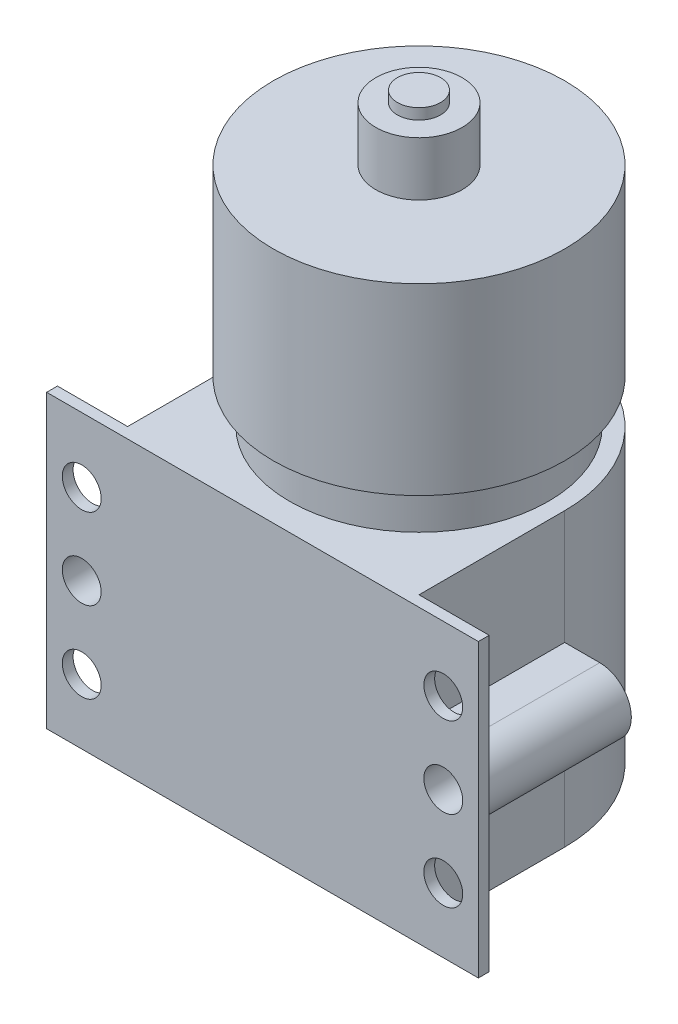
ISO-10303-21;
HEADER;
FILE_DESCRIPTION(('STEP AP214'),'2;1');
FILE_NAME('part.step','',(''),(''),'','','');
FILE_SCHEMA(('AUTOMOTIVE_DESIGN { 1 0 10303 214 1 1 1 1 }'));
ENDSEC;
DATA;
#1=APPLICATION_CONTEXT('core data for automotive mechanical design processes');
#2=APPLICATION_PROTOCOL_DEFINITION('international standard','automotive_design',2000,#1);
#3=PRODUCT_CONTEXT('',#1,'mechanical');
#4=PRODUCT('Part','Part','',(#3));
#5=PRODUCT_RELATED_PRODUCT_CATEGORY('part','',(#4));
#6=PRODUCT_DEFINITION_FORMATION('','',#4);
#7=PRODUCT_DEFINITION_CONTEXT('part definition',#1,'design');
#8=PRODUCT_DEFINITION('design','',#6,#7);
#9=PRODUCT_DEFINITION_SHAPE('','',#8);
#10=(LENGTH_UNIT() NAMED_UNIT(*) SI_UNIT(.MILLI.,.METRE.));
#11=(NAMED_UNIT(*) PLANE_ANGLE_UNIT() SI_UNIT($,.RADIAN.));
#12=(NAMED_UNIT(*) SI_UNIT($,.STERADIAN.) SOLID_ANGLE_UNIT());
#13=UNCERTAINTY_MEASURE_WITH_UNIT(LENGTH_MEASURE(1.E-05),#10,'distance_accuracy_value','');
#14=(GEOMETRIC_REPRESENTATION_CONTEXT(3) GLOBAL_UNCERTAINTY_ASSIGNED_CONTEXT((#13)) GLOBAL_UNIT_ASSIGNED_CONTEXT((#10,
#11,#12)) REPRESENTATION_CONTEXT('',''));
#15=CARTESIAN_POINT('',(0.,0.,0.));
#16=DIRECTION('',(0.,0.,1.));
#17=DIRECTION('',(1.,0.,0.));
#18=AXIS2_PLACEMENT_3D('',#15,#16,#17);
#19=CARTESIAN_POINT('',(13.5,27.,0.));
#20=DIRECTION('',(1.,0.,0.));
#21=DIRECTION('',(0.,0.,-1.));
#22=AXIS2_PLACEMENT_3D('',#19,#20,#21);
#23=PLANE('',#22);
#24=DIRECTION('',(0.,-1.,0.));
#25=VECTOR('',#24,1.);
#26=CARTESIAN_POINT('',(13.5,27.,0.));
#27=LINE('',#26,#25);
#28=CARTESIAN_POINT('',(13.5,10.575,0.));
#29=VERTEX_POINT('',#28);
#30=CARTESIAN_POINT('',(13.5,0.,0.));
#31=VERTEX_POINT('',#30);
#32=EDGE_CURVE('E258',#29,#31,#27,.T.);
#33=ORIENTED_EDGE('',*,*,#32,.F.);
#34=DIRECTION('',(0.,0.,1.));
#35=VECTOR('',#34,1.);
#36=CARTESIAN_POINT('',(13.5,10.575,0.));
#37=LINE('',#36,#35);
#38=CARTESIAN_POINT('',(13.5,10.575,13.5));
#39=VERTEX_POINT('',#38);
#40=EDGE_CURVE('E49',#29,#39,#37,.T.);
#41=ORIENTED_EDGE('',*,*,#40,.T.);
#42=DIRECTION('',(0.,-1.,0.));
#43=VECTOR('',#42,1.);
#44=CARTESIAN_POINT('',(13.5,27.,13.5));
#45=LINE('',#44,#43);
#46=CARTESIAN_POINT('',(13.5,0.,13.5));
#47=VERTEX_POINT('',#46);
#48=EDGE_CURVE('E262',#39,#47,#45,.T.);
#49=ORIENTED_EDGE('',*,*,#48,.T.);
#50=DIRECTION('',(0.,0.,1.));
#51=VECTOR('',#50,1.);
#52=CARTESIAN_POINT('',(13.5,0.,0.));
#53=LINE('',#52,#51);
#54=EDGE_CURVE('E250',#31,#47,#53,.T.);
#55=ORIENTED_EDGE('',*,*,#54,.F.);
#56=EDGE_LOOP('',(#33,#41,#49,#55));
#57=FACE_BOUND('',#56,.T.);
#58=ADVANCED_FACE('F34',(#57),#23,.T.);
#59=CARTESIAN_POINT('',(-13.5,27.,0.));
#60=DIRECTION('',(1.,0.,0.));
#61=DIRECTION('',(0.,0.,-1.));
#62=AXIS2_PLACEMENT_3D('',#59,#60,#61);
#63=PLANE('',#62);
#64=DIRECTION('',(0.,0.,1.));
#65=VECTOR('',#64,1.);
#66=CARTESIAN_POINT('',(-13.5,16.425,0.));
#67=LINE('',#66,#65);
#68=CARTESIAN_POINT('',(-13.5,16.425,0.));
#69=VERTEX_POINT('',#68);
#70=CARTESIAN_POINT('',(-13.5,16.425,13.5));
#71=VERTEX_POINT('',#70);
#72=EDGE_CURVE('E211',#69,#71,#67,.T.);
#73=ORIENTED_EDGE('',*,*,#72,.T.);
#74=DIRECTION('',(0.,-1.,0.));
#75=VECTOR('',#74,1.);
#76=CARTESIAN_POINT('',(-13.5,27.,13.5));
#77=LINE('',#76,#75);
#78=CARTESIAN_POINT('',(-13.5,27.,13.5));
#79=VERTEX_POINT('',#78);
#80=EDGE_CURVE('E42',#79,#71,#77,.T.);
#81=ORIENTED_EDGE('',*,*,#80,.F.);
#82=DIRECTION('',(0.,0.,1.));
#83=VECTOR('',#82,1.);
#84=CARTESIAN_POINT('',(-13.5,27.,0.));
#85=LINE('',#84,#83);
#86=CARTESIAN_POINT('',(-13.5,27.,0.));
#87=VERTEX_POINT('',#86);
#88=EDGE_CURVE('E216',#87,#79,#85,.T.);
#89=ORIENTED_EDGE('',*,*,#88,.F.);
#90=DIRECTION('',(0.,-1.,0.));
#91=VECTOR('',#90,1.);
#92=CARTESIAN_POINT('',(-13.5,27.,0.));
#93=LINE('',#92,#91);
#94=EDGE_CURVE('E255',#87,#69,#93,.T.);
#95=ORIENTED_EDGE('',*,*,#94,.T.);
#96=EDGE_LOOP('',(#73,#81,#89,#95));
#97=FACE_BOUND('',#96,.T.);
#98=ADVANCED_FACE('F307',(#97),#63,.F.);
#99=CARTESIAN_POINT('',(0.,27.,13.5));
#100=DIRECTION('',(0.,0.,-1.));
#101=DIRECTION('',(-1.,0.,0.));
#102=AXIS2_PLACEMENT_3D('',#99,#100,#101);
#103=PLANE('',#102);
#104=CARTESIAN_POINT('',(-16.75,21.,13.5));
#105=DIRECTION('',(0.,0.,-1.));
#106=DIRECTION('',(-1.,0.,0.));
#107=AXIS2_PLACEMENT_3D('',#104,#105,#106);
#108=CIRCLE('',#107,1.79999999999999);
#109=CARTESIAN_POINT('',(-18.55,21.,13.5));
#110=VERTEX_POINT('',#109);
#111=EDGE_CURVE('E617',#110,#110,#108,.T.);
#112=ORIENTED_EDGE('',*,*,#111,.F.);
#113=EDGE_LOOP('',(#112));
#114=FACE_BOUND('',#113,.T.);
#115=CARTESIAN_POINT('',(-16.75,6.,13.5));
#116=DIRECTION('',(0.,0.,-1.));
#117=DIRECTION('',(-1.,0.,0.));
#118=AXIS2_PLACEMENT_3D('',#115,#116,#117);
#119=CIRCLE('',#118,1.79999999999999);
#120=CARTESIAN_POINT('',(-18.55,6.,13.5));
#121=VERTEX_POINT('',#120);
#122=EDGE_CURVE('E620',#121,#121,#119,.T.);
#123=ORIENTED_EDGE('',*,*,#122,.F.);
#124=EDGE_LOOP('',(#123));
#125=FACE_BOUND('',#124,.T.);
#126=ORIENTED_EDGE('',*,*,#80,.T.);
#127=DIRECTION('',(1.,0.,0.));
#128=VECTOR('',#127,1.);
#129=CARTESIAN_POINT('',(0.,16.425,13.5));
#130=LINE('',#129,#128);
#131=CARTESIAN_POINT('',(-16.75,16.425,13.5));
#132=VERTEX_POINT('',#131);
#133=EDGE_CURVE('E57',#132,#71,#130,.T.);
#134=ORIENTED_EDGE('',*,*,#133,.F.);
#135=CARTESIAN_POINT('',(-16.75,13.5,13.5));
#136=DIRECTION('',(0.,0.,-1.));
#137=DIRECTION('',(-1.,0.,0.));
#138=AXIS2_PLACEMENT_3D('',#135,#136,#137);
#139=CIRCLE('',#138,2.92500000000001);
#140=CARTESIAN_POINT('',(-16.75,10.575,13.5));
#141=VERTEX_POINT('',#140);
#142=EDGE_CURVE('E159',#141,#132,#139,.T.);
#143=ORIENTED_EDGE('',*,*,#142,.F.);
#144=DIRECTION('',(1.,0.,0.));
#145=VECTOR('',#144,1.);
#146=CARTESIAN_POINT('',(0.,10.575,13.5));
#147=LINE('',#146,#145);
#148=CARTESIAN_POINT('',(-13.5,10.575,13.5));
#149=VERTEX_POINT('',#148);
#150=EDGE_CURVE('E192',#141,#149,#147,.T.);
#151=ORIENTED_EDGE('',*,*,#150,.T.);
#152=CARTESIAN_POINT('',(-13.5,0.,13.5));
#153=VERTEX_POINT('',#152);
#154=EDGE_CURVE('E274',#149,#153,#77,.T.);
#155=ORIENTED_EDGE('',*,*,#154,.T.);
#156=DIRECTION('',(1.,0.,0.));
#157=VECTOR('',#156,1.);
#158=CARTESIAN_POINT('',(0.,0.,13.5));
#159=LINE('',#158,#157);
#160=CARTESIAN_POINT('',(-20.,0.,13.5));
#161=VERTEX_POINT('',#160);
#162=EDGE_CURVE('E238',#161,#153,#159,.T.);
#163=ORIENTED_EDGE('',*,*,#162,.F.);
#164=DIRECTION('',(0.,-1.,0.));
#165=VECTOR('',#164,1.);
#166=CARTESIAN_POINT('',(-20.,27.,13.5));
#167=LINE('',#166,#165);
#168=CARTESIAN_POINT('',(-20.,27.,13.5));
#169=VERTEX_POINT('',#168);
#170=EDGE_CURVE('E273',#169,#161,#167,.T.);
#171=ORIENTED_EDGE('',*,*,#170,.F.);
#172=DIRECTION('',(1.,0.,0.));
#173=VECTOR('',#172,1.);
#174=CARTESIAN_POINT('',(0.,27.,13.5));
#175=LINE('',#174,#173);
#176=EDGE_CURVE('E218',#169,#79,#175,.T.);
#177=ORIENTED_EDGE('',*,*,#176,.T.);
#178=EDGE_LOOP('',(#126,#134,#143,#151,#155,#163,#171,#177));
#179=FACE_BOUND('',#178,.T.);
#180=ADVANCED_FACE('F278',(#114,#125,#179),#103,.T.);
#181=ORIENTED_EDGE('',*,*,#154,.F.);
#182=DIRECTION('',(0.,0.,1.));
#183=VECTOR('',#182,1.);
#184=CARTESIAN_POINT('',(-13.5,10.575,0.));
#185=LINE('',#184,#183);
#186=CARTESIAN_POINT('',(-13.5,10.575,0.));
#187=VERTEX_POINT('',#186);
#188=EDGE_CURVE('E208',#187,#149,#185,.T.);
#189=ORIENTED_EDGE('',*,*,#188,.F.);
#190=CARTESIAN_POINT('',(-13.5,0.,0.));
#191=VERTEX_POINT('',#190);
#192=EDGE_CURVE('E235',#187,#191,#93,.T.);
#193=ORIENTED_EDGE('',*,*,#192,.T.);
#194=DIRECTION('',(0.,0.,1.));
#195=VECTOR('',#194,1.);
#196=CARTESIAN_POINT('',(-13.5,0.,0.));
#197=LINE('',#196,#195);
#198=EDGE_CURVE('E215',#191,#153,#197,.T.);
#199=ORIENTED_EDGE('',*,*,#198,.T.);
#200=EDGE_LOOP('',(#181,#189,#193,#199));
#201=FACE_BOUND('',#200,.T.);
#202=ADVANCED_FACE('F36',(#201),#63,.F.);
#203=CARTESIAN_POINT('',(-20.,27.,0.));
#204=DIRECTION('',(1.,0.,0.));
#205=DIRECTION('',(0.,0.,-1.));
#206=AXIS2_PLACEMENT_3D('',#203,#204,#205);
#207=PLANE('',#206);
#208=DIRECTION('',(0.,0.,1.));
#209=VECTOR('',#208,1.);
#210=CARTESIAN_POINT('',(-20.,0.,0.));
#211=LINE('',#210,#209);
#212=CARTESIAN_POINT('',(-20.,0.,14.5));
#213=VERTEX_POINT('',#212);
#214=EDGE_CURVE('E241',#161,#213,#211,.T.);
#215=ORIENTED_EDGE('',*,*,#214,.T.);
#216=DIRECTION('',(0.,-1.,0.));
#217=VECTOR('',#216,1.);
#218=CARTESIAN_POINT('',(-20.,27.,14.5));
#219=LINE('',#218,#217);
#220=CARTESIAN_POINT('',(-20.,27.,14.5));
#221=VERTEX_POINT('',#220);
#222=EDGE_CURVE('E270',#221,#213,#219,.T.);
#223=ORIENTED_EDGE('',*,*,#222,.F.);
#224=DIRECTION('',(0.,0.,1.));
#225=VECTOR('',#224,1.);
#226=CARTESIAN_POINT('',(-20.,27.,0.));
#227=LINE('',#226,#225);
#228=EDGE_CURVE('E222',#169,#221,#227,.T.);
#229=ORIENTED_EDGE('',*,*,#228,.F.);
#230=ORIENTED_EDGE('',*,*,#170,.T.);
#231=EDGE_LOOP('',(#215,#223,#229,#230));
#232=FACE_BOUND('',#231,.T.);
#233=ADVANCED_FACE('F290',(#232),#207,.F.);
#234=CARTESIAN_POINT('',(0.,27.,14.5));
#235=DIRECTION('',(0.,0.,-1.));
#236=DIRECTION('',(-1.,0.,0.));
#237=AXIS2_PLACEMENT_3D('',#234,#235,#236);
#238=PLANE('',#237);
#239=CARTESIAN_POINT('',(16.75,21.,14.5));
#240=DIRECTION('',(0.,0.,-1.));
#241=DIRECTION('',(-1.,0.,0.));
#242=AXIS2_PLACEMENT_3D('',#239,#240,#241);
#243=CIRCLE('',#242,1.8);
#244=CARTESIAN_POINT('',(14.95,21.,14.5));
#245=VERTEX_POINT('',#244);
#246=EDGE_CURVE('E702',#245,#245,#243,.T.);
#247=ORIENTED_EDGE('',*,*,#246,.T.);
#248=EDGE_LOOP('',(#247));
#249=FACE_BOUND('',#248,.T.);
#250=CARTESIAN_POINT('',(16.75,13.5,14.5));
#251=DIRECTION('',(0.,0.,-1.));
#252=DIRECTION('',(-1.,0.,0.));
#253=AXIS2_PLACEMENT_3D('',#250,#251,#252);
#254=CIRCLE('',#253,1.8);
#255=CARTESIAN_POINT('',(14.95,13.5,14.5));
#256=VERTEX_POINT('',#255);
#257=EDGE_CURVE('E712',#256,#256,#254,.T.);
#258=ORIENTED_EDGE('',*,*,#257,.T.);
#259=EDGE_LOOP('',(#258));
#260=FACE_BOUND('',#259,.T.);
#261=CARTESIAN_POINT('',(16.75,6.,14.5));
#262=DIRECTION('',(0.,0.,-1.));
#263=DIRECTION('',(-1.,0.,0.));
#264=AXIS2_PLACEMENT_3D('',#261,#262,#263);
#265=CIRCLE('',#264,1.8);
#266=CARTESIAN_POINT('',(14.95,6.,14.5));
#267=VERTEX_POINT('',#266);
#268=EDGE_CURVE('E718',#267,#267,#265,.T.);
#269=ORIENTED_EDGE('',*,*,#268,.T.);
#270=EDGE_LOOP('',(#269));
#271=FACE_BOUND('',#270,.T.);
#272=CARTESIAN_POINT('',(-16.75,21.,14.5));
#273=DIRECTION('',(0.,0.,-1.));
#274=DIRECTION('',(-1.,0.,0.));
#275=AXIS2_PLACEMENT_3D('',#272,#273,#274);
#276=CIRCLE('',#275,1.8);
#277=CARTESIAN_POINT('',(-18.55,21.,14.5));
#278=VERTEX_POINT('',#277);
#279=EDGE_CURVE('E623',#278,#278,#276,.T.);
#280=ORIENTED_EDGE('',*,*,#279,.T.);
#281=EDGE_LOOP('',(#280));
#282=FACE_BOUND('',#281,.T.);
#283=CARTESIAN_POINT('',(-16.75,6.,14.5));
#284=DIRECTION('',(0.,0.,-1.));
#285=DIRECTION('',(-1.,0.,0.));
#286=AXIS2_PLACEMENT_3D('',#283,#284,#285);
#287=CIRCLE('',#286,1.8);
#288=CARTESIAN_POINT('',(-18.55,6.,14.5));
#289=VERTEX_POINT('',#288);
#290=EDGE_CURVE('E622',#289,#289,#287,.T.);
#291=ORIENTED_EDGE('',*,*,#290,.T.);
#292=EDGE_LOOP('',(#291));
#293=FACE_BOUND('',#292,.T.);
#294=CARTESIAN_POINT('',(-16.75,13.5,14.5));
#295=DIRECTION('',(0.,0.,-1.));
#296=DIRECTION('',(-1.,0.,0.));
#297=AXIS2_PLACEMENT_3D('',#294,#295,#296);
#298=CIRCLE('',#297,1.8);
#299=CARTESIAN_POINT('',(-18.55,13.5,14.5));
#300=VERTEX_POINT('',#299);
#301=EDGE_CURVE('E634',#300,#300,#298,.T.);
#302=ORIENTED_EDGE('',*,*,#301,.T.);
#303=EDGE_LOOP('',(#302));
#304=FACE_BOUND('',#303,.T.);
#305=DIRECTION('',(1.,0.,0.));
#306=VECTOR('',#305,1.);
#307=CARTESIAN_POINT('',(0.,0.,14.5));
#308=LINE('',#307,#306);
#309=CARTESIAN_POINT('',(20.,0.,14.5));
#310=VERTEX_POINT('',#309);
#311=EDGE_CURVE('E244',#213,#310,#308,.T.);
#312=ORIENTED_EDGE('',*,*,#311,.T.);
#313=DIRECTION('',(0.,-1.,0.));
#314=VECTOR('',#313,1.);
#315=CARTESIAN_POINT('',(20.,27.,14.5));
#316=LINE('',#315,#314);
#317=CARTESIAN_POINT('',(20.,27.,14.5));
#318=VERTEX_POINT('',#317);
#319=EDGE_CURVE('E268',#318,#310,#316,.T.);
#320=ORIENTED_EDGE('',*,*,#319,.F.);
#321=DIRECTION('',(1.,0.,0.));
#322=VECTOR('',#321,1.);
#323=CARTESIAN_POINT('',(0.,27.,14.5));
#324=LINE('',#323,#322);
#325=EDGE_CURVE('E225',#221,#318,#324,.T.);
#326=ORIENTED_EDGE('',*,*,#325,.F.);
#327=ORIENTED_EDGE('',*,*,#222,.T.);
#328=EDGE_LOOP('',(#312,#320,#326,#327));
#329=FACE_BOUND('',#328,.T.);
#330=ADVANCED_FACE('F294',(#249,#260,#271,#282,#293,#304,#329),#238,.F.);
#331=CARTESIAN_POINT('',(20.,27.,0.));
#332=DIRECTION('',(1.,0.,0.));
#333=DIRECTION('',(0.,0.,-1.));
#334=AXIS2_PLACEMENT_3D('',#331,#332,#333);
#335=PLANE('',#334);
#336=DIRECTION('',(0.,0.,1.));
#337=VECTOR('',#336,1.);
#338=CARTESIAN_POINT('',(20.,0.,0.));
#339=LINE('',#338,#337);
#340=CARTESIAN_POINT('',(20.,0.,13.5));
#341=VERTEX_POINT('',#340);
#342=EDGE_CURVE('E247',#341,#310,#339,.T.);
#343=ORIENTED_EDGE('',*,*,#342,.F.);
#344=DIRECTION('',(0.,-1.,0.));
#345=VECTOR('',#344,1.);
#346=CARTESIAN_POINT('',(20.,27.,13.5));
#347=LINE('',#346,#345);
#348=CARTESIAN_POINT('',(20.,27.,13.5));
#349=VERTEX_POINT('',#348);
#350=EDGE_CURVE('E266',#349,#341,#347,.T.);
#351=ORIENTED_EDGE('',*,*,#350,.F.);
#352=DIRECTION('',(0.,0.,1.));
#353=VECTOR('',#352,1.);
#354=CARTESIAN_POINT('',(20.,27.,0.));
#355=LINE('',#354,#353);
#356=EDGE_CURVE('E227',#349,#318,#355,.T.);
#357=ORIENTED_EDGE('',*,*,#356,.T.);
#358=ORIENTED_EDGE('',*,*,#319,.T.);
#359=EDGE_LOOP('',(#343,#351,#357,#358));
#360=FACE_BOUND('',#359,.T.);
#361=ADVANCED_FACE('F333',(#360),#335,.T.);
#362=CARTESIAN_POINT('',(16.75,21.,13.5));
#363=DIRECTION('',(0.,0.,-1.));
#364=DIRECTION('',(-1.,0.,0.));
#365=AXIS2_PLACEMENT_3D('',#362,#363,#364);
#366=CIRCLE('',#365,1.79999999999999);
#367=CARTESIAN_POINT('',(14.95,21.,13.5));
#368=VERTEX_POINT('',#367);
#369=EDGE_CURVE('E705',#368,#368,#366,.T.);
#370=ORIENTED_EDGE('',*,*,#369,.F.);
#371=EDGE_LOOP('',(#370));
#372=FACE_BOUND('',#371,.T.);
#373=CARTESIAN_POINT('',(16.75,6.,13.5));
#374=DIRECTION('',(0.,0.,-1.));
#375=DIRECTION('',(-1.,0.,0.));
#376=AXIS2_PLACEMENT_3D('',#373,#374,#375);
#377=CIRCLE('',#376,1.79999999999999);
#378=CARTESIAN_POINT('',(14.95,6.,13.5));
#379=VERTEX_POINT('',#378);
#380=EDGE_CURVE('E715',#379,#379,#377,.T.);
#381=ORIENTED_EDGE('',*,*,#380,.F.);
#382=EDGE_LOOP('',(#381));
#383=FACE_BOUND('',#382,.T.);
#384=DIRECTION('',(-1.,0.,0.));
#385=VECTOR('',#384,1.);
#386=CARTESIAN_POINT('',(0.,16.425,13.5));
#387=LINE('',#386,#385);
#388=CARTESIAN_POINT('',(16.75,16.425,13.5));
#389=VERTEX_POINT('',#388);
#390=CARTESIAN_POINT('',(13.5,16.425,13.5));
#391=VERTEX_POINT('',#390);
#392=EDGE_CURVE('E156',#389,#391,#387,.T.);
#393=ORIENTED_EDGE('',*,*,#392,.T.);
#394=CARTESIAN_POINT('',(13.5,27.,13.5));
#395=VERTEX_POINT('',#394);
#396=EDGE_CURVE('E263',#395,#391,#45,.T.);
#397=ORIENTED_EDGE('',*,*,#396,.F.);
#398=EDGE_CURVE('E223',#395,#349,#175,.T.);
#399=ORIENTED_EDGE('',*,*,#398,.T.);
#400=ORIENTED_EDGE('',*,*,#350,.T.);
#401=EDGE_CURVE('E242',#47,#341,#159,.T.);
#402=ORIENTED_EDGE('',*,*,#401,.F.);
#403=ORIENTED_EDGE('',*,*,#48,.F.);
#404=DIRECTION('',(-1.,0.,0.));
#405=VECTOR('',#404,1.);
#406=CARTESIAN_POINT('',(0.,10.575,13.5));
#407=LINE('',#406,#405);
#408=CARTESIAN_POINT('',(16.75,10.575,13.5));
#409=VERTEX_POINT('',#408);
#410=EDGE_CURVE('E172',#409,#39,#407,.T.);
#411=ORIENTED_EDGE('',*,*,#410,.F.);
#412=CARTESIAN_POINT('',(16.75,13.5,13.5));
#413=DIRECTION('',(0.,0.,-1.));
#414=DIRECTION('',(-1.,0.,0.));
#415=AXIS2_PLACEMENT_3D('',#412,#413,#414);
#416=CIRCLE('',#415,2.925);
#417=EDGE_CURVE('E174',#389,#409,#416,.T.);
#418=ORIENTED_EDGE('',*,*,#417,.F.);
#419=EDGE_LOOP('',(#393,#397,#399,#400,#402,#403,#411,#418));
#420=FACE_BOUND('',#419,.T.);
#421=ADVANCED_FACE('F330',(#372,#383,#420),#103,.T.);
#422=DIRECTION('',(0.,0.,1.));
#423=VECTOR('',#422,1.);
#424=CARTESIAN_POINT('',(13.5,16.425,0.));
#425=LINE('',#424,#423);
#426=CARTESIAN_POINT('',(13.5,16.425,0.));
#427=VERTEX_POINT('',#426);
#428=EDGE_CURVE('E182',#427,#391,#425,.T.);
#429=ORIENTED_EDGE('',*,*,#428,.F.);
#430=CARTESIAN_POINT('',(13.5,27.,0.));
#431=VERTEX_POINT('',#430);
#432=EDGE_CURVE('E259',#431,#427,#27,.T.);
#433=ORIENTED_EDGE('',*,*,#432,.F.);
#434=DIRECTION('',(0.,0.,1.));
#435=VECTOR('',#434,1.);
#436=CARTESIAN_POINT('',(13.5,27.,0.));
#437=LINE('',#436,#435);
#438=EDGE_CURVE('E230',#431,#395,#437,.T.);
#439=ORIENTED_EDGE('',*,*,#438,.T.);
#440=ORIENTED_EDGE('',*,*,#396,.T.);
#441=EDGE_LOOP('',(#429,#433,#439,#440));
#442=FACE_BOUND('',#441,.T.);
#443=ADVANCED_FACE('F340',(#442),#23,.T.);
#444=CARTESIAN_POINT('',(0.,27.,0.));
#445=DIRECTION('',(0.,-1.,0.));
#446=DIRECTION('',(0.,0.,-1.));
#447=AXIS2_PLACEMENT_3D('',#444,#445,#446);
#448=CYLINDRICAL_SURFACE('',#447,13.5);
#449=CARTESIAN_POINT('',(0.,0.,0.));
#450=DIRECTION('',(0.,1.,0.));
#451=DIRECTION('',(0.,0.,1.));
#452=AXIS2_PLACEMENT_3D('',#449,#450,#451);
#453=CIRCLE('',#452,13.5);
#454=EDGE_CURVE('E219',#31,#191,#453,.T.);
#455=ORIENTED_EDGE('',*,*,#454,.T.);
#456=ORIENTED_EDGE('',*,*,#192,.F.);
#457=DIRECTION('',(0.,-1.,0.));
#458=VECTOR('',#457,1.);
#459=CARTESIAN_POINT('',(-13.5,0.,0.));
#460=LINE('',#459,#458);
#461=EDGE_CURVE('E195',#69,#187,#460,.T.);
#462=ORIENTED_EDGE('',*,*,#461,.F.);
#463=ORIENTED_EDGE('',*,*,#94,.F.);
#464=CARTESIAN_POINT('',(0.,27.,0.));
#465=DIRECTION('',(0.,1.,0.));
#466=DIRECTION('',(0.,0.,1.));
#467=AXIS2_PLACEMENT_3D('',#464,#465,#466);
#468=CIRCLE('',#467,13.5);
#469=EDGE_CURVE('E233',#431,#87,#468,.T.);
#470=ORIENTED_EDGE('',*,*,#469,.F.);
#471=ORIENTED_EDGE('',*,*,#432,.T.);
#472=DIRECTION('',(0.,1.,0.));
#473=VECTOR('',#472,1.);
#474=CARTESIAN_POINT('',(13.5,0.,0.));
#475=LINE('',#474,#473);
#476=EDGE_CURVE('E171',#29,#427,#475,.T.);
#477=ORIENTED_EDGE('',*,*,#476,.F.);
#478=ORIENTED_EDGE('',*,*,#32,.T.);
#479=EDGE_LOOP('',(#455,#456,#462,#463,#470,#471,#477,#478));
#480=FACE_BOUND('',#479,.T.);
#481=ADVANCED_FACE('F321',(#480),#448,.T.);
#482=CARTESIAN_POINT('',(0.,27.,0.));
#483=DIRECTION('',(0.,1.,0.));
#484=DIRECTION('',(0.,0.,1.));
#485=AXIS2_PLACEMENT_3D('',#482,#483,#484);
#486=PLANE('',#485);
#487=CARTESIAN_POINT('',(0.,27.,0.));
#488=DIRECTION('',(0.,1.,0.));
#489=DIRECTION('',(0.,0.,1.));
#490=AXIS2_PLACEMENT_3D('',#487,#488,#489);
#491=CIRCLE('',#490,12.);
#492=CARTESIAN_POINT('',(0.,27.,12.));
#493=VERTEX_POINT('',#492);
#494=EDGE_CURVE('E11',#493,#493,#491,.T.);
#495=ORIENTED_EDGE('',*,*,#494,.F.);
#496=EDGE_LOOP('',(#495));
#497=FACE_BOUND('',#496,.T.);
#498=ORIENTED_EDGE('',*,*,#88,.T.);
#499=ORIENTED_EDGE('',*,*,#176,.F.);
#500=ORIENTED_EDGE('',*,*,#228,.T.);
#501=ORIENTED_EDGE('',*,*,#325,.T.);
#502=ORIENTED_EDGE('',*,*,#356,.F.);
#503=ORIENTED_EDGE('',*,*,#398,.F.);
#504=ORIENTED_EDGE('',*,*,#438,.F.);
#505=ORIENTED_EDGE('',*,*,#469,.T.);
#506=EDGE_LOOP('',(#498,#499,#500,#501,#502,#503,#504,#505));
#507=FACE_BOUND('',#506,.T.);
#508=ADVANCED_FACE('F298',(#497,#507),#486,.T.);
#509=CARTESIAN_POINT('',(0.,0.,0.));
#510=DIRECTION('',(0.,1.,0.));
#511=DIRECTION('',(0.,0.,1.));
#512=AXIS2_PLACEMENT_3D('',#509,#510,#511);
#513=PLANE('',#512);
#514=ORIENTED_EDGE('',*,*,#198,.F.);
#515=ORIENTED_EDGE('',*,*,#454,.F.);
#516=ORIENTED_EDGE('',*,*,#54,.T.);
#517=ORIENTED_EDGE('',*,*,#401,.T.);
#518=ORIENTED_EDGE('',*,*,#342,.T.);
#519=ORIENTED_EDGE('',*,*,#311,.F.);
#520=ORIENTED_EDGE('',*,*,#214,.F.);
#521=ORIENTED_EDGE('',*,*,#162,.T.);
#522=EDGE_LOOP('',(#514,#515,#516,#517,#518,#519,#520,#521));
#523=FACE_BOUND('',#522,.T.);
#524=ADVANCED_FACE('F286',(#523),#513,.F.);
#525=CARTESIAN_POINT('',(-16.75,13.5,0.));
#526=DIRECTION('',(0.,0.,1.));
#527=DIRECTION('',(1.,0.,0.));
#528=AXIS2_PLACEMENT_3D('',#525,#526,#527);
#529=CYLINDRICAL_SURFACE('',#528,2.92500000000001);
#530=ORIENTED_EDGE('',*,*,#142,.T.);
#531=DIRECTION('',(0.,0.,1.));
#532=VECTOR('',#531,1.);
#533=CARTESIAN_POINT('',(-16.75,16.425,0.));
#534=LINE('',#533,#532);
#535=CARTESIAN_POINT('',(-16.75,16.425,0.));
#536=VERTEX_POINT('',#535);
#537=EDGE_CURVE('E213',#536,#132,#534,.T.);
#538=ORIENTED_EDGE('',*,*,#537,.F.);
#539=CARTESIAN_POINT('',(-16.75,13.5,0.));
#540=DIRECTION('',(0.,0.,-1.));
#541=DIRECTION('',(-1.,0.,0.));
#542=AXIS2_PLACEMENT_3D('',#539,#540,#541);
#543=CIRCLE('',#542,2.92500000000001);
#544=CARTESIAN_POINT('',(-16.75,10.575,0.));
#545=VERTEX_POINT('',#544);
#546=EDGE_CURVE('E188',#545,#536,#543,.T.);
#547=ORIENTED_EDGE('',*,*,#546,.F.);
#548=DIRECTION('',(0.,0.,1.));
#549=VECTOR('',#548,1.);
#550=CARTESIAN_POINT('',(-16.75,10.575,0.));
#551=LINE('',#550,#549);
#552=EDGE_CURVE('E201',#545,#141,#551,.T.);
#553=ORIENTED_EDGE('',*,*,#552,.T.);
#554=EDGE_LOOP('',(#530,#538,#547,#553));
#555=FACE_BOUND('',#554,.T.);
#556=ADVANCED_FACE('F314',(#555),#529,.T.);
#557=CARTESIAN_POINT('',(0.,16.425,0.));
#558=DIRECTION('',(0.,-1.,0.));
#559=DIRECTION('',(0.,0.,-1.));
#560=AXIS2_PLACEMENT_3D('',#557,#558,#559);
#561=PLANE('',#560);
#562=ORIENTED_EDGE('',*,*,#133,.T.);
#563=ORIENTED_EDGE('',*,*,#72,.F.);
#564=DIRECTION('',(1.,0.,0.));
#565=VECTOR('',#564,1.);
#566=CARTESIAN_POINT('',(0.,16.425,0.));
#567=LINE('',#566,#565);
#568=EDGE_CURVE('E191',#536,#69,#567,.T.);
#569=ORIENTED_EDGE('',*,*,#568,.F.);
#570=ORIENTED_EDGE('',*,*,#537,.T.);
#571=EDGE_LOOP('',(#562,#563,#569,#570));
#572=FACE_BOUND('',#571,.T.);
#573=ADVANCED_FACE('F310',(#572),#561,.F.);
#574=CARTESIAN_POINT('',(0.,10.575,0.));
#575=DIRECTION('',(0.,-1.,0.));
#576=DIRECTION('',(0.,0.,-1.));
#577=AXIS2_PLACEMENT_3D('',#574,#575,#576);
#578=PLANE('',#577);
#579=ORIENTED_EDGE('',*,*,#150,.F.);
#580=ORIENTED_EDGE('',*,*,#552,.F.);
#581=DIRECTION('',(1.,0.,0.));
#582=VECTOR('',#581,1.);
#583=CARTESIAN_POINT('',(0.,10.575,0.));
#584=LINE('',#583,#582);
#585=EDGE_CURVE('E198',#545,#187,#584,.T.);
#586=ORIENTED_EDGE('',*,*,#585,.T.);
#587=ORIENTED_EDGE('',*,*,#188,.T.);
#588=EDGE_LOOP('',(#579,#580,#586,#587));
#589=FACE_BOUND('',#588,.T.);
#590=ADVANCED_FACE('F317',(#589),#578,.T.);
#591=CARTESIAN_POINT('',(0.,0.,0.));
#592=DIRECTION('',(0.,0.,-1.));
#593=DIRECTION('',(-1.,0.,0.));
#594=AXIS2_PLACEMENT_3D('',#591,#592,#593);
#595=PLANE('',#594);
#596=CARTESIAN_POINT('',(-16.75,13.5,0.));
#597=DIRECTION('',(0.,0.,-1.));
#598=DIRECTION('',(-1.,0.,0.));
#599=AXIS2_PLACEMENT_3D('',#596,#597,#598);
#600=CIRCLE('',#599,1.79999999999999);
#601=CARTESIAN_POINT('',(-18.55,13.5,0.));
#602=VERTEX_POINT('',#601);
#603=EDGE_CURVE('E626',#602,#602,#600,.T.);
#604=ORIENTED_EDGE('',*,*,#603,.F.);
#605=EDGE_LOOP('',(#604));
#606=FACE_BOUND('',#605,.T.);
#607=ORIENTED_EDGE('',*,*,#546,.T.);
#608=ORIENTED_EDGE('',*,*,#568,.T.);
#609=ORIENTED_EDGE('',*,*,#461,.T.);
#610=ORIENTED_EDGE('',*,*,#585,.F.);
#611=EDGE_LOOP('',(#607,#608,#609,#610));
#612=FACE_BOUND('',#611,.T.);
#613=ADVANCED_FACE('F319',(#606,#612),#595,.T.);
#614=CARTESIAN_POINT('',(0.,16.425,0.));
#615=DIRECTION('',(0.,1.,0.));
#616=DIRECTION('',(0.,0.,1.));
#617=AXIS2_PLACEMENT_3D('',#614,#615,#616);
#618=PLANE('',#617);
#619=ORIENTED_EDGE('',*,*,#392,.F.);
#620=DIRECTION('',(0.,0.,1.));
#621=VECTOR('',#620,1.);
#622=CARTESIAN_POINT('',(16.75,16.425,0.));
#623=LINE('',#622,#621);
#624=CARTESIAN_POINT('',(16.75,16.425,0.));
#625=VERTEX_POINT('',#624);
#626=EDGE_CURVE('E149',#625,#389,#623,.T.);
#627=ORIENTED_EDGE('',*,*,#626,.F.);
#628=DIRECTION('',(-1.,0.,0.));
#629=VECTOR('',#628,1.);
#630=CARTESIAN_POINT('',(0.,16.425,0.));
#631=LINE('',#630,#629);
#632=EDGE_CURVE('E153',#625,#427,#631,.T.);
#633=ORIENTED_EDGE('',*,*,#632,.T.);
#634=ORIENTED_EDGE('',*,*,#428,.T.);
#635=EDGE_LOOP('',(#619,#627,#633,#634));
#636=FACE_BOUND('',#635,.T.);
#637=ADVANCED_FACE('F151',(#636),#618,.T.);
#638=CARTESIAN_POINT('',(16.75,13.5,0.));
#639=DIRECTION('',(0.,0.,1.));
#640=DIRECTION('',(1.,0.,0.));
#641=AXIS2_PLACEMENT_3D('',#638,#639,#640);
#642=CYLINDRICAL_SURFACE('',#641,2.925);
#643=ORIENTED_EDGE('',*,*,#417,.T.);
#644=DIRECTION('',(0.,0.,1.));
#645=VECTOR('',#644,1.);
#646=CARTESIAN_POINT('',(16.75,10.575,0.));
#647=LINE('',#646,#645);
#648=CARTESIAN_POINT('',(16.75,10.575,0.));
#649=VERTEX_POINT('',#648);
#650=EDGE_CURVE('E160',#649,#409,#647,.T.);
#651=ORIENTED_EDGE('',*,*,#650,.F.);
#652=CARTESIAN_POINT('',(16.75,13.5,0.));
#653=DIRECTION('',(0.,0.,-1.));
#654=DIRECTION('',(-1.,0.,0.));
#655=AXIS2_PLACEMENT_3D('',#652,#653,#654);
#656=CIRCLE('',#655,2.925);
#657=EDGE_CURVE('E163',#625,#649,#656,.T.);
#658=ORIENTED_EDGE('',*,*,#657,.F.);
#659=ORIENTED_EDGE('',*,*,#626,.T.);
#660=EDGE_LOOP('',(#643,#651,#658,#659));
#661=FACE_BOUND('',#660,.T.);
#662=ADVANCED_FACE('F164',(#661),#642,.T.);
#663=CARTESIAN_POINT('',(0.,10.575,0.));
#664=DIRECTION('',(0.,1.,0.));
#665=DIRECTION('',(-1.,0.,0.));
#666=AXIS2_PLACEMENT_3D('',#663,#664,#665);
#667=PLANE('',#666);
#668=ORIENTED_EDGE('',*,*,#410,.T.);
#669=ORIENTED_EDGE('',*,*,#40,.F.);
#670=DIRECTION('',(-1.,0.,0.));
#671=VECTOR('',#670,1.);
#672=CARTESIAN_POINT('',(0.,10.575,0.));
#673=LINE('',#672,#671);
#674=EDGE_CURVE('E167',#649,#29,#673,.T.);
#675=ORIENTED_EDGE('',*,*,#674,.F.);
#676=ORIENTED_EDGE('',*,*,#650,.T.);
#677=EDGE_LOOP('',(#668,#669,#675,#676));
#678=FACE_BOUND('',#677,.T.);
#679=ADVANCED_FACE('F356',(#678),#667,.F.);
#680=CARTESIAN_POINT('',(0.,0.,0.));
#681=DIRECTION('',(0.,0.,-1.));
#682=DIRECTION('',(-1.,0.,0.));
#683=AXIS2_PLACEMENT_3D('',#680,#681,#682);
#684=PLANE('',#683);
#685=CARTESIAN_POINT('',(16.75,13.5,0.));
#686=DIRECTION('',(0.,0.,-1.));
#687=DIRECTION('',(-1.,0.,0.));
#688=AXIS2_PLACEMENT_3D('',#685,#686,#687);
#689=CIRCLE('',#688,1.79999999999999);
#690=CARTESIAN_POINT('',(14.95,13.5,0.));
#691=VERTEX_POINT('',#690);
#692=EDGE_CURVE('E707',#691,#691,#689,.T.);
#693=ORIENTED_EDGE('',*,*,#692,.F.);
#694=EDGE_LOOP('',(#693));
#695=FACE_BOUND('',#694,.T.);
#696=ORIENTED_EDGE('',*,*,#632,.F.);
#697=ORIENTED_EDGE('',*,*,#657,.T.);
#698=ORIENTED_EDGE('',*,*,#674,.T.);
#699=ORIENTED_EDGE('',*,*,#476,.T.);
#700=EDGE_LOOP('',(#696,#697,#698,#699));
#701=FACE_BOUND('',#700,.T.);
#702=ADVANCED_FACE('F169',(#695,#701),#684,.T.);
#703=CARTESIAN_POINT('',(0.,31.,0.));
#704=DIRECTION('',(0.,-1.,0.));
#705=DIRECTION('',(0.,0.,-1.));
#706=AXIS2_PLACEMENT_3D('',#703,#704,#705);
#707=CYLINDRICAL_SURFACE('',#706,12.);
#708=CARTESIAN_POINT('',(0.,31.,0.));
#709=DIRECTION('',(0.,-1.,0.));
#710=DIRECTION('',(0.,0.,-1.));
#711=AXIS2_PLACEMENT_3D('',#708,#709,#710);
#712=CIRCLE('',#711,12.);
#713=CARTESIAN_POINT('',(0.,31.,-12.));
#714=VERTEX_POINT('',#713);
#715=EDGE_CURVE('E177',#714,#714,#712,.F.);
#716=ORIENTED_EDGE('',*,*,#715,.F.);
#717=EDGE_LOOP('',(#716));
#718=FACE_BOUND('',#717,.T.);
#719=ORIENTED_EDGE('',*,*,#494,.T.);
#720=EDGE_LOOP('',(#719));
#721=FACE_BOUND('',#720,.T.);
#722=ADVANCED_FACE('F363',(#718,#721),#707,.T.);
#723=CARTESIAN_POINT('',(0.,48.,0.));
#724=DIRECTION('',(0.,-1.,0.));
#725=DIRECTION('',(0.,0.,-1.));
#726=AXIS2_PLACEMENT_3D('',#723,#724,#725);
#727=CYLINDRICAL_SURFACE('',#726,13.5);
#728=CARTESIAN_POINT('',(0.,48.,0.));
#729=DIRECTION('',(0.,-1.,0.));
#730=DIRECTION('',(0.,0.,-1.));
#731=AXIS2_PLACEMENT_3D('',#728,#729,#730);
#732=CIRCLE('',#731,13.5);
#733=CARTESIAN_POINT('',(0.,48.,-13.5));
#734=VERTEX_POINT('',#733);
#735=EDGE_CURVE('E650',#734,#734,#732,.T.);
#736=ORIENTED_EDGE('',*,*,#735,.T.);
#737=EDGE_LOOP('',(#736));
#738=FACE_BOUND('',#737,.T.);
#739=CARTESIAN_POINT('',(0.,31.,0.));
#740=DIRECTION('',(0.,-1.,0.));
#741=DIRECTION('',(0.,0.,-1.));
#742=AXIS2_PLACEMENT_3D('',#739,#740,#741);
#743=CIRCLE('',#742,13.5);
#744=CARTESIAN_POINT('',(0.,31.,-13.5));
#745=VERTEX_POINT('',#744);
#746=EDGE_CURVE('E647',#745,#745,#743,.T.);
#747=ORIENTED_EDGE('',*,*,#746,.F.);
#748=EDGE_LOOP('',(#747));
#749=FACE_BOUND('',#748,.T.);
#750=ADVANCED_FACE('F437',(#738,#749),#727,.T.);
#751=CARTESIAN_POINT('',(0.,48.,0.));
#752=DIRECTION('',(0.,-1.,0.));
#753=DIRECTION('',(0.,0.,-1.));
#754=AXIS2_PLACEMENT_3D('',#751,#752,#753);
#755=PLANE('',#754);
#756=CARTESIAN_POINT('',(0.,48.,0.));
#757=DIRECTION('',(0.,-1.,0.));
#758=DIRECTION('',(0.,0.,-1.));
#759=AXIS2_PLACEMENT_3D('',#756,#757,#758);
#760=CIRCLE('',#759,4.);
#761=CARTESIAN_POINT('',(0.,48.,-4.));
#762=VERTEX_POINT('',#761);
#763=EDGE_CURVE('E641',#762,#762,#760,.T.);
#764=ORIENTED_EDGE('',*,*,#763,.T.);
#765=EDGE_LOOP('',(#764));
#766=FACE_BOUND('',#765,.T.);
#767=ORIENTED_EDGE('',*,*,#735,.F.);
#768=EDGE_LOOP('',(#767));
#769=FACE_BOUND('',#768,.T.);
#770=ADVANCED_FACE('F447',(#766,#769),#755,.F.);
#771=CARTESIAN_POINT('',(0.,31.,0.));
#772=DIRECTION('',(0.,-1.,0.));
#773=DIRECTION('',(0.,0.,-1.));
#774=AXIS2_PLACEMENT_3D('',#771,#772,#773);
#775=PLANE('',#774);
#776=ORIENTED_EDGE('',*,*,#715,.T.);
#777=EDGE_LOOP('',(#776));
#778=FACE_BOUND('',#777,.T.);
#779=ORIENTED_EDGE('',*,*,#746,.T.);
#780=EDGE_LOOP('',(#779));
#781=FACE_BOUND('',#780,.T.);
#782=ADVANCED_FACE('F455',(#778,#781),#775,.T.);
#783=CARTESIAN_POINT('',(0.,53.,0.));
#784=DIRECTION('',(0.,-1.,0.));
#785=DIRECTION('',(0.,0.,-1.));
#786=AXIS2_PLACEMENT_3D('',#783,#784,#785);
#787=CYLINDRICAL_SURFACE('',#786,4.);
#788=CARTESIAN_POINT('',(0.,53.,0.));
#789=DIRECTION('',(0.,-1.,0.));
#790=DIRECTION('',(0.,0.,-1.));
#791=AXIS2_PLACEMENT_3D('',#788,#789,#790);
#792=CIRCLE('',#791,4.);
#793=CARTESIAN_POINT('',(0.,53.,-4.));
#794=VERTEX_POINT('',#793);
#795=EDGE_CURVE('E644',#794,#794,#792,.T.);
#796=ORIENTED_EDGE('',*,*,#795,.T.);
#797=EDGE_LOOP('',(#796));
#798=FACE_BOUND('',#797,.T.);
#799=ORIENTED_EDGE('',*,*,#763,.F.);
#800=EDGE_LOOP('',(#799));
#801=FACE_BOUND('',#800,.T.);
#802=ADVANCED_FACE('F460',(#798,#801),#787,.T.);
#803=CARTESIAN_POINT('',(0.,53.,0.));
#804=DIRECTION('',(0.,-1.,0.));
#805=DIRECTION('',(0.,0.,-1.));
#806=AXIS2_PLACEMENT_3D('',#803,#804,#805);
#807=PLANE('',#806);
#808=CARTESIAN_POINT('',(0.,53.,0.));
#809=DIRECTION('',(0.,-1.,0.));
#810=DIRECTION('',(0.,0.,-1.));
#811=AXIS2_PLACEMENT_3D('',#808,#809,#810);
#812=CIRCLE('',#811,2.);
#813=CARTESIAN_POINT('',(0.,53.,-2.));
#814=VERTEX_POINT('',#813);
#815=EDGE_CURVE('E637',#814,#814,#812,.T.);
#816=ORIENTED_EDGE('',*,*,#815,.T.);
#817=EDGE_LOOP('',(#816));
#818=FACE_BOUND('',#817,.T.);
#819=ORIENTED_EDGE('',*,*,#795,.F.);
#820=EDGE_LOOP('',(#819));
#821=FACE_BOUND('',#820,.T.);
#822=ADVANCED_FACE('F477',(#818,#821),#807,.F.);
#823=CARTESIAN_POINT('',(0.,54.,0.));
#824=DIRECTION('',(0.,-1.,0.));
#825=DIRECTION('',(0.,0.,-1.));
#826=AXIS2_PLACEMENT_3D('',#823,#824,#825);
#827=CYLINDRICAL_SURFACE('',#826,2.);
#828=CARTESIAN_POINT('',(0.,54.,0.));
#829=DIRECTION('',(0.,-1.,0.));
#830=DIRECTION('',(0.,0.,-1.));
#831=AXIS2_PLACEMENT_3D('',#828,#829,#830);
#832=CIRCLE('',#831,2.);
#833=CARTESIAN_POINT('',(0.,54.,-2.));
#834=VERTEX_POINT('',#833);
#835=EDGE_CURVE('E638',#834,#834,#832,.T.);
#836=ORIENTED_EDGE('',*,*,#835,.T.);
#837=EDGE_LOOP('',(#836));
#838=FACE_BOUND('',#837,.T.);
#839=ORIENTED_EDGE('',*,*,#815,.F.);
#840=EDGE_LOOP('',(#839));
#841=FACE_BOUND('',#840,.T.);
#842=ADVANCED_FACE('F487',(#838,#841),#827,.T.);
#843=CARTESIAN_POINT('',(0.,54.,0.));
#844=DIRECTION('',(0.,-1.,0.));
#845=DIRECTION('',(0.,0.,-1.));
#846=AXIS2_PLACEMENT_3D('',#843,#844,#845);
#847=PLANE('',#846);
#848=ORIENTED_EDGE('',*,*,#835,.F.);
#849=EDGE_LOOP('',(#848));
#850=FACE_BOUND('',#849,.T.);
#851=ADVANCED_FACE('F497',(#850),#847,.F.);
#852=CARTESIAN_POINT('',(-16.75,13.5,0.));
#853=DIRECTION('',(0.,0.,-1.));
#854=DIRECTION('',(-1.,0.,0.));
#855=AXIS2_PLACEMENT_3D('',#852,#853,#854);
#856=CYLINDRICAL_SURFACE('',#855,1.79999999999999);
#857=ORIENTED_EDGE('',*,*,#301,.F.);
#858=EDGE_LOOP('',(#857));
#859=FACE_BOUND('',#858,.T.);
#860=ORIENTED_EDGE('',*,*,#603,.T.);
#861=EDGE_LOOP('',(#860));
#862=FACE_BOUND('',#861,.T.);
#863=ADVANCED_FACE('F507',(#859,#862),#856,.F.);
#864=CARTESIAN_POINT('',(-16.75,6.,13.5));
#865=DIRECTION('',(0.,0.,-1.));
#866=DIRECTION('',(-1.,0.,0.));
#867=AXIS2_PLACEMENT_3D('',#864,#865,#866);
#868=CYLINDRICAL_SURFACE('',#867,1.79999999999999);
#869=ORIENTED_EDGE('',*,*,#290,.F.);
#870=EDGE_LOOP('',(#869));
#871=FACE_BOUND('',#870,.T.);
#872=ORIENTED_EDGE('',*,*,#122,.T.);
#873=EDGE_LOOP('',(#872));
#874=FACE_BOUND('',#873,.T.);
#875=ADVANCED_FACE('F673',(#871,#874),#868,.F.);
#876=CARTESIAN_POINT('',(-16.75,21.,13.5));
#877=DIRECTION('',(0.,0.,-1.));
#878=DIRECTION('',(-1.,0.,0.));
#879=AXIS2_PLACEMENT_3D('',#876,#877,#878);
#880=CYLINDRICAL_SURFACE('',#879,1.79999999999999);
#881=ORIENTED_EDGE('',*,*,#279,.F.);
#882=EDGE_LOOP('',(#881));
#883=FACE_BOUND('',#882,.T.);
#884=ORIENTED_EDGE('',*,*,#111,.T.);
#885=EDGE_LOOP('',(#884));
#886=FACE_BOUND('',#885,.T.);
#887=ADVANCED_FACE('F679',(#883,#886),#880,.F.);
#888=CARTESIAN_POINT('',(16.75,6.,13.5));
#889=DIRECTION('',(0.,0.,-1.));
#890=DIRECTION('',(-1.,0.,0.));
#891=AXIS2_PLACEMENT_3D('',#888,#889,#890);
#892=CYLINDRICAL_SURFACE('',#891,1.79999999999999);
#893=ORIENTED_EDGE('',*,*,#268,.F.);
#894=EDGE_LOOP('',(#893));
#895=FACE_BOUND('',#894,.T.);
#896=ORIENTED_EDGE('',*,*,#380,.T.);
#897=EDGE_LOOP('',(#896));
#898=FACE_BOUND('',#897,.T.);
#899=ADVANCED_FACE('F685',(#895,#898),#892,.F.);
#900=CARTESIAN_POINT('',(16.75,13.5,0.));
#901=DIRECTION('',(0.,0.,-1.));
#902=DIRECTION('',(-1.,0.,0.));
#903=AXIS2_PLACEMENT_3D('',#900,#901,#902);
#904=CYLINDRICAL_SURFACE('',#903,1.79999999999999);
#905=ORIENTED_EDGE('',*,*,#257,.F.);
#906=EDGE_LOOP('',(#905));
#907=FACE_BOUND('',#906,.T.);
#908=ORIENTED_EDGE('',*,*,#692,.T.);
#909=EDGE_LOOP('',(#908));
#910=FACE_BOUND('',#909,.T.);
#911=ADVANCED_FACE('F689',(#907,#910),#904,.F.);
#912=CARTESIAN_POINT('',(16.75,21.,13.5));
#913=DIRECTION('',(0.,0.,-1.));
#914=DIRECTION('',(-1.,0.,0.));
#915=AXIS2_PLACEMENT_3D('',#912,#913,#914);
#916=CYLINDRICAL_SURFACE('',#915,1.79999999999999);
#917=ORIENTED_EDGE('',*,*,#246,.F.);
#918=EDGE_LOOP('',(#917));
#919=FACE_BOUND('',#918,.T.);
#920=ORIENTED_EDGE('',*,*,#369,.T.);
#921=EDGE_LOOP('',(#920));
#922=FACE_BOUND('',#921,.T.);
#923=ADVANCED_FACE('F693',(#919,#922),#916,.F.);
#924=CLOSED_SHELL('',(#58,#98,#180,#202,#233,#330,#361,#421,#443,#481,#508,#524,#556,#573,#590,
#613,#637,#662,#679,#702,#722,#750,#770,#782,#802,#822,#842,#851,#863,#875,#887,#899,#911,#923));
#925=MANIFOLD_SOLID_BREP('B2',#924);
#926=ADVANCED_BREP_SHAPE_REPRESENTATION('',(#18,#925),#14);
#927=SHAPE_DEFINITION_REPRESENTATION(#9,#926);
ENDSEC;
END-ISO-10303-21;
